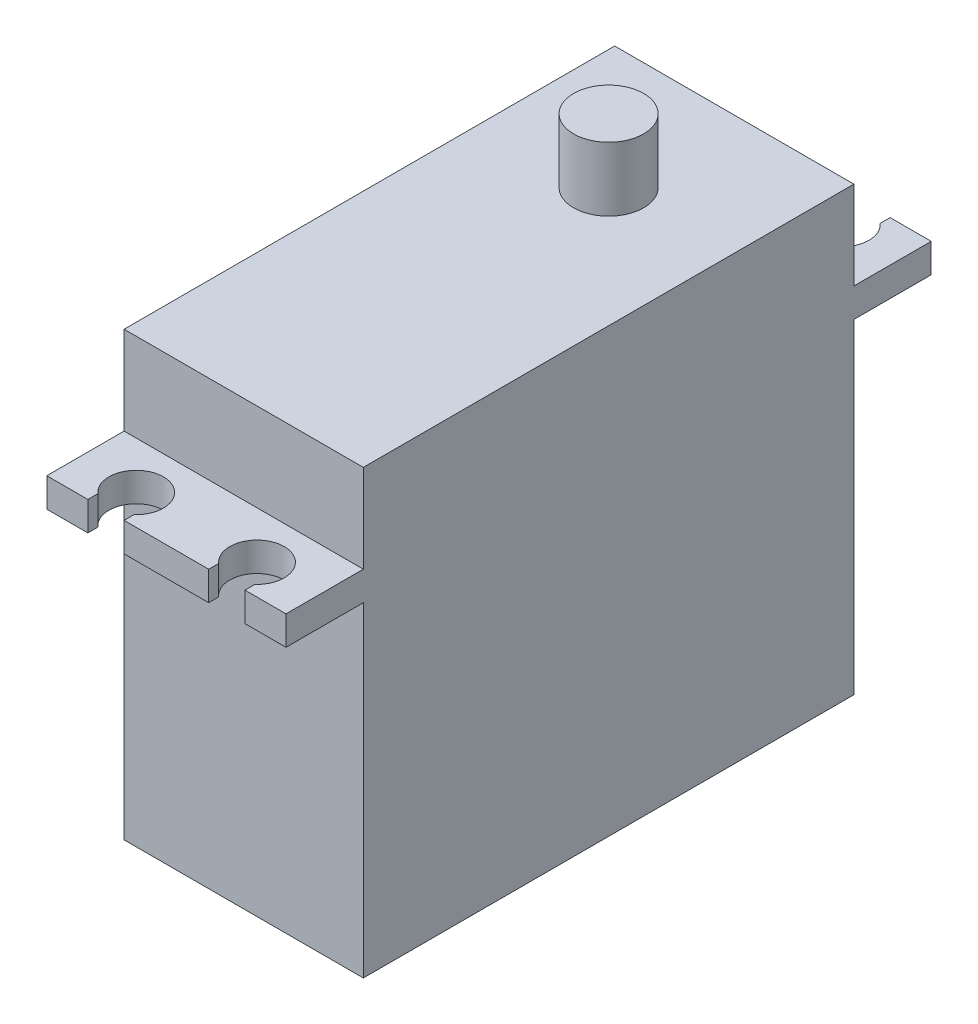
ISO-10303-21;
HEADER;
FILE_DESCRIPTION(('STEP AP214'),'2;1');
FILE_NAME('part.step','',(''),(''),'','','');
FILE_SCHEMA(('AUTOMOTIVE_DESIGN { 1 0 10303 214 1 1 1 1 }'));
ENDSEC;
DATA;
#1=APPLICATION_CONTEXT('core data for automotive mechanical design processes');
#2=APPLICATION_PROTOCOL_DEFINITION('international standard','automotive_design',2000,#1);
#3=PRODUCT_CONTEXT('',#1,'mechanical');
#4=PRODUCT('Part','Part','',(#3));
#5=PRODUCT_RELATED_PRODUCT_CATEGORY('part','',(#4));
#6=PRODUCT_DEFINITION_FORMATION('','',#4);
#7=PRODUCT_DEFINITION_CONTEXT('part definition',#1,'design');
#8=PRODUCT_DEFINITION('design','',#6,#7);
#9=PRODUCT_DEFINITION_SHAPE('','',#8);
#10=(LENGTH_UNIT() NAMED_UNIT(*) SI_UNIT(.MILLI.,.METRE.));
#11=(NAMED_UNIT(*) PLANE_ANGLE_UNIT() SI_UNIT($,.RADIAN.));
#12=(NAMED_UNIT(*) SI_UNIT($,.STERADIAN.) SOLID_ANGLE_UNIT());
#13=UNCERTAINTY_MEASURE_WITH_UNIT(LENGTH_MEASURE(1.E-05),#10,'distance_accuracy_value','');
#14=(GEOMETRIC_REPRESENTATION_CONTEXT(3) GLOBAL_UNCERTAINTY_ASSIGNED_CONTEXT((#13)) GLOBAL_UNIT_ASSIGNED_CONTEXT((#10,
#11,#12)) REPRESENTATION_CONTEXT('',''));
#15=CARTESIAN_POINT('',(0.,0.,0.));
#16=DIRECTION('',(0.,0.,1.));
#17=DIRECTION('',(1.,0.,0.));
#18=AXIS2_PLACEMENT_3D('',#15,#16,#17);
#19=CARTESIAN_POINT('',(19.8,0.,26.7));
#20=DIRECTION('',(0.,0.,-1.));
#21=DIRECTION('',(-1.,0.,0.));
#22=AXIS2_PLACEMENT_3D('',#19,#20,#21);
#23=PLANE('',#22);
#24=DIRECTION('',(0.,1.,0.));
#25=VECTOR('',#24,1.);
#26=CARTESIAN_POINT('',(13.4,-18.3000000000001,26.7));
#27=LINE('',#26,#25);
#28=CARTESIAN_POINT('',(13.4,8.59999999999999,26.7));
#29=VERTEX_POINT('',#28);
#30=CARTESIAN_POINT('',(13.4,10.9999999999999,26.7));
#31=VERTEX_POINT('',#30);
#32=EDGE_CURVE('E59',#29,#31,#27,.T.);
#33=ORIENTED_EDGE('',*,*,#32,.T.);
#34=DIRECTION('',(-1.,0.,0.));
#35=VECTOR('',#34,1.);
#36=CARTESIAN_POINT('',(19.8,11.,26.7));
#37=LINE('',#36,#35);
#38=CARTESIAN_POINT('',(6.4,10.9999999999999,26.7));
#39=VERTEX_POINT('',#38);
#40=EDGE_CURVE('E409',#31,#39,#37,.T.);
#41=ORIENTED_EDGE('',*,*,#40,.T.);
#42=DIRECTION('',(0.,1.,0.));
#43=VECTOR('',#42,1.);
#44=CARTESIAN_POINT('',(6.4,-18.3000000000001,26.7));
#45=LINE('',#44,#43);
#46=CARTESIAN_POINT('',(6.4,8.59999999999999,26.7));
#47=VERTEX_POINT('',#46);
#48=EDGE_CURVE('E247',#47,#39,#45,.T.);
#49=ORIENTED_EDGE('',*,*,#48,.F.);
#50=DIRECTION('',(-1.,0.,0.));
#51=VECTOR('',#50,1.);
#52=CARTESIAN_POINT('',(19.8,8.59999999999999,26.7));
#53=LINE('',#52,#51);
#54=EDGE_CURVE('E404',#29,#47,#53,.T.);
#55=ORIENTED_EDGE('',*,*,#54,.F.);
#56=EDGE_LOOP('',(#33,#41,#49,#55));
#57=FACE_BOUND('',#56,.T.);
#58=ADVANCED_FACE('F36',(#57),#23,.F.);
#59=DIRECTION('',(0.,1.,0.));
#60=VECTOR('',#59,1.);
#61=CARTESIAN_POINT('',(3.4,-18.3000000000001,26.7));
#62=LINE('',#61,#60);
#63=CARTESIAN_POINT('',(3.40000000000001,8.59999999999999,26.7));
#64=VERTEX_POINT('',#63);
#65=CARTESIAN_POINT('',(3.4,10.9999999999999,26.7));
#66=VERTEX_POINT('',#65);
#67=EDGE_CURVE('E51',#64,#66,#62,.T.);
#68=ORIENTED_EDGE('',*,*,#67,.T.);
#69=CARTESIAN_POINT('',(0.,11.,26.7));
#70=VERTEX_POINT('',#69);
#71=EDGE_CURVE('E241',#66,#70,#37,.T.);
#72=ORIENTED_EDGE('',*,*,#71,.T.);
#73=DIRECTION('',(0.,-1.,0.));
#74=VECTOR('',#73,1.);
#75=CARTESIAN_POINT('',(0.,0.,26.7));
#76=LINE('',#75,#74);
#77=CARTESIAN_POINT('',(0.,8.59999999999999,26.7));
#78=VERTEX_POINT('',#77);
#79=EDGE_CURVE('E363',#70,#78,#76,.T.);
#80=ORIENTED_EDGE('',*,*,#79,.T.);
#81=EDGE_CURVE('E400',#64,#78,#53,.T.);
#82=ORIENTED_EDGE('',*,*,#81,.F.);
#83=EDGE_LOOP('',(#68,#72,#80,#82));
#84=FACE_BOUND('',#83,.T.);
#85=ADVANCED_FACE('F454',(#84),#23,.F.);
#86=CARTESIAN_POINT('',(19.8,0.,-26.7));
#87=DIRECTION('',(0.,0.,-1.));
#88=DIRECTION('',(-1.,0.,0.));
#89=AXIS2_PLACEMENT_3D('',#86,#87,#88);
#90=PLANE('',#89);
#91=DIRECTION('',(-1.,0.,0.));
#92=VECTOR('',#91,1.);
#93=CARTESIAN_POINT('',(19.8,8.59999999999999,-26.7));
#94=LINE('',#93,#92);
#95=CARTESIAN_POINT('',(13.4,8.59999999999999,-26.7));
#96=VERTEX_POINT('',#95);
#97=CARTESIAN_POINT('',(6.4,8.59999999999999,-26.7));
#98=VERTEX_POINT('',#97);
#99=EDGE_CURVE('E391',#96,#98,#94,.T.);
#100=ORIENTED_EDGE('',*,*,#99,.T.);
#101=DIRECTION('',(0.,1.,0.));
#102=VECTOR('',#101,1.);
#103=CARTESIAN_POINT('',(6.4,-18.3,-26.7));
#104=LINE('',#103,#102);
#105=CARTESIAN_POINT('',(6.4,11.,-26.7));
#106=VERTEX_POINT('',#105);
#107=EDGE_CURVE('E265',#98,#106,#104,.T.);
#108=ORIENTED_EDGE('',*,*,#107,.T.);
#109=DIRECTION('',(-1.,0.,0.));
#110=VECTOR('',#109,1.);
#111=CARTESIAN_POINT('',(19.8,11.,-26.7));
#112=LINE('',#111,#110);
#113=CARTESIAN_POINT('',(13.4,11.,-26.7));
#114=VERTEX_POINT('',#113);
#115=EDGE_CURVE('E386',#114,#106,#112,.T.);
#116=ORIENTED_EDGE('',*,*,#115,.F.);
#117=DIRECTION('',(0.,1.,0.));
#118=VECTOR('',#117,1.);
#119=CARTESIAN_POINT('',(13.4,-18.3,-26.7));
#120=LINE('',#119,#118);
#121=EDGE_CURVE('E295',#96,#114,#120,.T.);
#122=ORIENTED_EDGE('',*,*,#121,.F.);
#123=EDGE_LOOP('',(#100,#108,#116,#122));
#124=FACE_BOUND('',#123,.T.);
#125=ADVANCED_FACE('F525',(#124),#90,.T.);
#126=CARTESIAN_POINT('',(19.8,8.59999999999999,-26.7));
#127=VERTEX_POINT('',#126);
#128=CARTESIAN_POINT('',(16.4,8.59999999999999,-26.7));
#129=VERTEX_POINT('',#128);
#130=EDGE_CURVE('E387',#127,#129,#94,.T.);
#131=ORIENTED_EDGE('',*,*,#130,.T.);
#132=DIRECTION('',(0.,1.,0.));
#133=VECTOR('',#132,1.);
#134=CARTESIAN_POINT('',(16.4,-18.3,-26.7));
#135=LINE('',#134,#133);
#136=CARTESIAN_POINT('',(16.4,11.,-26.7));
#137=VERTEX_POINT('',#136);
#138=EDGE_CURVE('E297',#129,#137,#135,.T.);
#139=ORIENTED_EDGE('',*,*,#138,.T.);
#140=CARTESIAN_POINT('',(19.8,11.,-26.7));
#141=VERTEX_POINT('',#140);
#142=EDGE_CURVE('E382',#141,#137,#112,.T.);
#143=ORIENTED_EDGE('',*,*,#142,.F.);
#144=DIRECTION('',(0.,-1.,0.));
#145=VECTOR('',#144,1.);
#146=CARTESIAN_POINT('',(19.8,0.,-26.7));
#147=LINE('',#146,#145);
#148=EDGE_CURVE('E346',#141,#127,#147,.T.);
#149=ORIENTED_EDGE('',*,*,#148,.T.);
#150=EDGE_LOOP('',(#131,#139,#143,#149));
#151=FACE_BOUND('',#150,.T.);
#152=ADVANCED_FACE('F509',(#151),#90,.T.);
#153=CARTESIAN_POINT('',(19.8,0.,0.));
#154=DIRECTION('',(1.,0.,0.));
#155=DIRECTION('',(0.,0.,-1.));
#156=AXIS2_PLACEMENT_3D('',#153,#154,#155);
#157=PLANE('',#156);
#158=DIRECTION('',(0.,0.,-1.));
#159=VECTOR('',#158,1.);
#160=CARTESIAN_POINT('',(19.8,18.3,0.));
#161=LINE('',#160,#159);
#162=CARTESIAN_POINT('',(19.8,18.3,20.3));
#163=VERTEX_POINT('',#162);
#164=CARTESIAN_POINT('',(19.8,18.3,-20.3));
#165=VERTEX_POINT('',#164);
#166=EDGE_CURVE('E327',#163,#165,#161,.T.);
#167=ORIENTED_EDGE('',*,*,#166,.F.);
#168=DIRECTION('',(0.,-1.,0.));
#169=VECTOR('',#168,1.);
#170=CARTESIAN_POINT('',(19.8,0.,20.3));
#171=LINE('',#170,#169);
#172=CARTESIAN_POINT('',(19.8,11.,20.3));
#173=VERTEX_POINT('',#172);
#174=EDGE_CURVE('E332',#163,#173,#171,.T.);
#175=ORIENTED_EDGE('',*,*,#174,.T.);
#176=DIRECTION('',(0.,0.,1.));
#177=VECTOR('',#176,1.);
#178=CARTESIAN_POINT('',(19.8,11.,0.));
#179=LINE('',#178,#177);
#180=CARTESIAN_POINT('',(19.8,11.,26.7));
#181=VERTEX_POINT('',#180);
#182=EDGE_CURVE('E334',#173,#181,#179,.T.);
#183=ORIENTED_EDGE('',*,*,#182,.T.);
#184=DIRECTION('',(0.,-1.,0.));
#185=VECTOR('',#184,1.);
#186=CARTESIAN_POINT('',(19.8,0.,26.7));
#187=LINE('',#186,#185);
#188=CARTESIAN_POINT('',(19.8,8.59999999999999,26.7));
#189=VERTEX_POINT('',#188);
#190=EDGE_CURVE('E337',#181,#189,#187,.T.);
#191=ORIENTED_EDGE('',*,*,#190,.T.);
#192=DIRECTION('',(0.,0.,1.));
#193=VECTOR('',#192,1.);
#194=CARTESIAN_POINT('',(19.8,8.59999999999999,0.));
#195=LINE('',#194,#193);
#196=CARTESIAN_POINT('',(19.8,8.59999999999999,20.3));
#197=VERTEX_POINT('',#196);
#198=EDGE_CURVE('E339',#197,#189,#195,.T.);
#199=ORIENTED_EDGE('',*,*,#198,.F.);
#200=CARTESIAN_POINT('',(19.8,-18.3,20.3));
#201=VERTEX_POINT('',#200);
#202=EDGE_CURVE('E335',#197,#201,#171,.T.);
#203=ORIENTED_EDGE('',*,*,#202,.T.);
#204=DIRECTION('',(0.,0.,-1.));
#205=VECTOR('',#204,1.);
#206=CARTESIAN_POINT('',(19.8,-18.3,0.));
#207=LINE('',#206,#205);
#208=CARTESIAN_POINT('',(19.8,-18.3,-20.3));
#209=VERTEX_POINT('',#208);
#210=EDGE_CURVE('E342',#201,#209,#207,.T.);
#211=ORIENTED_EDGE('',*,*,#210,.T.);
#212=DIRECTION('',(0.,-1.,0.));
#213=VECTOR('',#212,1.);
#214=CARTESIAN_POINT('',(19.8,0.,-20.3));
#215=LINE('',#214,#213);
#216=CARTESIAN_POINT('',(19.8,8.6,-20.3));
#217=VERTEX_POINT('',#216);
#218=EDGE_CURVE('E329',#217,#209,#215,.T.);
#219=ORIENTED_EDGE('',*,*,#218,.F.);
#220=DIRECTION('',(0.,0.,-1.));
#221=VECTOR('',#220,1.);
#222=CARTESIAN_POINT('',(19.8,8.60000000000001,0.));
#223=LINE('',#222,#221);
#224=EDGE_CURVE('E344',#217,#127,#223,.T.);
#225=ORIENTED_EDGE('',*,*,#224,.T.);
#226=ORIENTED_EDGE('',*,*,#148,.F.);
#227=DIRECTION('',(0.,0.,-1.));
#228=VECTOR('',#227,1.);
#229=CARTESIAN_POINT('',(19.8,11.,0.));
#230=LINE('',#229,#228);
#231=CARTESIAN_POINT('',(19.8,11.,-20.3));
#232=VERTEX_POINT('',#231);
#233=EDGE_CURVE('E349',#232,#141,#230,.T.);
#234=ORIENTED_EDGE('',*,*,#233,.F.);
#235=EDGE_CURVE('E324',#165,#232,#215,.T.);
#236=ORIENTED_EDGE('',*,*,#235,.F.);
#237=EDGE_LOOP('',(#167,#175,#183,#191,#199,#203,#211,#219,#225,#226,#234,#236));
#238=FACE_BOUND('',#237,.T.);
#239=ADVANCED_FACE('F472',(#238),#157,.T.);
#240=CARTESIAN_POINT('',(19.8,23.6,0.));
#241=DIRECTION('',(0.,1.,0.));
#242=DIRECTION('',(0.,0.,1.));
#243=AXIS2_PLACEMENT_3D('',#240,#241,#242);
#244=PLANE('',#243);
#245=CARTESIAN_POINT('',(9.9,23.6,-9.9));
#246=DIRECTION('',(0.,1.,0.));
#247=DIRECTION('',(0.,0.,1.));
#248=AXIS2_PLACEMENT_3D('',#245,#246,#247);
#249=CIRCLE('',#248,2.9);
#250=CARTESIAN_POINT('',(9.9,23.6,-7.));
#251=VERTEX_POINT('',#250);
#252=EDGE_CURVE('E320',#251,#251,#249,.T.);
#253=ORIENTED_EDGE('',*,*,#252,.T.);
#254=EDGE_LOOP('',(#253));
#255=FACE_BOUND('',#254,.T.);
#256=ADVANCED_FACE('F38',(#255),#244,.T.);
#257=CARTESIAN_POINT('',(0.,0.,0.));
#258=DIRECTION('',(1.,0.,0.));
#259=DIRECTION('',(0.,0.,-1.));
#260=AXIS2_PLACEMENT_3D('',#257,#258,#259);
#261=PLANE('',#260);
#262=DIRECTION('',(0.,0.,-1.));
#263=VECTOR('',#262,1.);
#264=CARTESIAN_POINT('',(0.,18.3,0.));
#265=LINE('',#264,#263);
#266=CARTESIAN_POINT('',(0.,18.3,20.3));
#267=VERTEX_POINT('',#266);
#268=CARTESIAN_POINT('',(0.,18.3,-20.3));
#269=VERTEX_POINT('',#268);
#270=EDGE_CURVE('E355',#267,#269,#265,.T.);
#271=ORIENTED_EDGE('',*,*,#270,.T.);
#272=DIRECTION('',(0.,-1.,0.));
#273=VECTOR('',#272,1.);
#274=CARTESIAN_POINT('',(0.,0.,-20.3));
#275=LINE('',#274,#273);
#276=CARTESIAN_POINT('',(0.,11.,-20.3));
#277=VERTEX_POINT('',#276);
#278=EDGE_CURVE('E323',#269,#277,#275,.T.);
#279=ORIENTED_EDGE('',*,*,#278,.T.);
#280=DIRECTION('',(0.,0.,-1.));
#281=VECTOR('',#280,1.);
#282=CARTESIAN_POINT('',(0.,11.,0.));
#283=LINE('',#282,#281);
#284=CARTESIAN_POINT('',(0.,11.,-26.7));
#285=VERTEX_POINT('',#284);
#286=EDGE_CURVE('E328',#277,#285,#283,.T.);
#287=ORIENTED_EDGE('',*,*,#286,.T.);
#288=DIRECTION('',(0.,-1.,0.));
#289=VECTOR('',#288,1.);
#290=CARTESIAN_POINT('',(0.,0.,-26.7));
#291=LINE('',#290,#289);
#292=CARTESIAN_POINT('',(0.,8.59999999999999,-26.7));
#293=VERTEX_POINT('',#292);
#294=EDGE_CURVE('E375',#285,#293,#291,.T.);
#295=ORIENTED_EDGE('',*,*,#294,.T.);
#296=DIRECTION('',(0.,0.,-1.));
#297=VECTOR('',#296,1.);
#298=CARTESIAN_POINT('',(0.,8.60000000000001,0.));
#299=LINE('',#298,#297);
#300=CARTESIAN_POINT('',(0.,8.6,-20.3));
#301=VERTEX_POINT('',#300);
#302=EDGE_CURVE('E372',#301,#293,#299,.T.);
#303=ORIENTED_EDGE('',*,*,#302,.F.);
#304=CARTESIAN_POINT('',(0.,-18.3,-20.3));
#305=VERTEX_POINT('',#304);
#306=EDGE_CURVE('E356',#301,#305,#275,.T.);
#307=ORIENTED_EDGE('',*,*,#306,.T.);
#308=DIRECTION('',(0.,0.,-1.));
#309=VECTOR('',#308,1.);
#310=CARTESIAN_POINT('',(0.,-18.3,0.));
#311=LINE('',#310,#309);
#312=CARTESIAN_POINT('',(0.,-18.3,20.3));
#313=VERTEX_POINT('',#312);
#314=EDGE_CURVE('E369',#313,#305,#311,.T.);
#315=ORIENTED_EDGE('',*,*,#314,.F.);
#316=DIRECTION('',(0.,-1.,0.));
#317=VECTOR('',#316,1.);
#318=CARTESIAN_POINT('',(0.,0.,20.3));
#319=LINE('',#318,#317);
#320=CARTESIAN_POINT('',(0.,8.59999999999999,20.3));
#321=VERTEX_POINT('',#320);
#322=EDGE_CURVE('E361',#321,#313,#319,.T.);
#323=ORIENTED_EDGE('',*,*,#322,.F.);
#324=DIRECTION('',(0.,0.,1.));
#325=VECTOR('',#324,1.);
#326=CARTESIAN_POINT('',(0.,8.59999999999999,0.));
#327=LINE('',#326,#325);
#328=EDGE_CURVE('E366',#321,#78,#327,.T.);
#329=ORIENTED_EDGE('',*,*,#328,.T.);
#330=ORIENTED_EDGE('',*,*,#79,.F.);
#331=DIRECTION('',(0.,0.,1.));
#332=VECTOR('',#331,1.);
#333=CARTESIAN_POINT('',(0.,11.,0.));
#334=LINE('',#333,#332);
#335=CARTESIAN_POINT('',(0.,11.,20.3));
#336=VERTEX_POINT('',#335);
#337=EDGE_CURVE('E360',#336,#70,#334,.T.);
#338=ORIENTED_EDGE('',*,*,#337,.F.);
#339=EDGE_CURVE('E358',#267,#336,#319,.T.);
#340=ORIENTED_EDGE('',*,*,#339,.F.);
#341=EDGE_LOOP('',(#271,#279,#287,#295,#303,#307,#315,#323,#329,#330,#338,#340));
#342=FACE_BOUND('',#341,.T.);
#343=ADVANCED_FACE('F458',(#342),#261,.F.);
#344=CARTESIAN_POINT('',(19.8,0.,-20.3));
#345=DIRECTION('',(0.,0.,-1.));
#346=DIRECTION('',(0.,1.,0.));
#347=AXIS2_PLACEMENT_3D('',#344,#345,#346);
#348=PLANE('',#347);
#349=ORIENTED_EDGE('',*,*,#278,.F.);
#350=DIRECTION('',(-1.,0.,0.));
#351=VECTOR('',#350,1.);
#352=CARTESIAN_POINT('',(19.8,18.3,-20.3));
#353=LINE('',#352,#351);
#354=EDGE_CURVE('E414',#165,#269,#353,.T.);
#355=ORIENTED_EDGE('',*,*,#354,.F.);
#356=ORIENTED_EDGE('',*,*,#235,.T.);
#357=DIRECTION('',(-1.,0.,0.));
#358=VECTOR('',#357,1.);
#359=CARTESIAN_POINT('',(19.8,11.,-20.3));
#360=LINE('',#359,#358);
#361=EDGE_CURVE('E352',#232,#277,#360,.T.);
#362=ORIENTED_EDGE('',*,*,#361,.T.);
#363=EDGE_LOOP('',(#349,#355,#356,#362));
#364=FACE_BOUND('',#363,.T.);
#365=ADVANCED_FACE('F484',(#364),#348,.T.);
#366=CARTESIAN_POINT('',(19.8,18.3,0.));
#367=DIRECTION('',(0.,1.,0.));
#368=DIRECTION('',(0.,0.,1.));
#369=AXIS2_PLACEMENT_3D('',#366,#367,#368);
#370=PLANE('',#369);
#371=CARTESIAN_POINT('',(9.9,18.3,-9.9));
#372=DIRECTION('',(0.,1.,0.));
#373=DIRECTION('',(0.,0.,1.));
#374=AXIS2_PLACEMENT_3D('',#371,#372,#373);
#375=CIRCLE('',#374,2.9);
#376=CARTESIAN_POINT('',(9.9,18.3,-7.));
#377=VERTEX_POINT('',#376);
#378=EDGE_CURVE('E317',#377,#377,#375,.T.);
#379=ORIENTED_EDGE('',*,*,#378,.F.);
#380=EDGE_LOOP('',(#379));
#381=FACE_BOUND('',#380,.T.);
#382=ORIENTED_EDGE('',*,*,#270,.F.);
#383=DIRECTION('',(-1.,0.,0.));
#384=VECTOR('',#383,1.);
#385=CARTESIAN_POINT('',(19.8,18.3,20.3));
#386=LINE('',#385,#384);
#387=EDGE_CURVE('E412',#163,#267,#386,.T.);
#388=ORIENTED_EDGE('',*,*,#387,.F.);
#389=ORIENTED_EDGE('',*,*,#166,.T.);
#390=ORIENTED_EDGE('',*,*,#354,.T.);
#391=EDGE_LOOP('',(#382,#388,#389,#390));
#392=FACE_BOUND('',#391,.T.);
#393=ADVANCED_FACE('F480',(#381,#392),#370,.T.);
#394=CARTESIAN_POINT('',(19.8,0.,20.3));
#395=DIRECTION('',(0.,0.,-1.));
#396=DIRECTION('',(0.,1.,0.));
#397=AXIS2_PLACEMENT_3D('',#394,#395,#396);
#398=PLANE('',#397);
#399=ORIENTED_EDGE('',*,*,#339,.T.);
#400=DIRECTION('',(-1.,0.,0.));
#401=VECTOR('',#400,1.);
#402=CARTESIAN_POINT('',(19.8,11.,20.3));
#403=LINE('',#402,#401);
#404=EDGE_CURVE('E408',#173,#336,#403,.T.);
#405=ORIENTED_EDGE('',*,*,#404,.F.);
#406=ORIENTED_EDGE('',*,*,#174,.F.);
#407=ORIENTED_EDGE('',*,*,#387,.T.);
#408=EDGE_LOOP('',(#399,#405,#406,#407));
#409=FACE_BOUND('',#408,.T.);
#410=ADVANCED_FACE('F556',(#409),#398,.F.);
#411=CARTESIAN_POINT('',(19.8,11.,0.));
#412=DIRECTION('',(0.,-1.,0.));
#413=DIRECTION('',(0.,0.,-1.));
#414=AXIS2_PLACEMENT_3D('',#411,#412,#413);
#415=PLANE('',#414);
#416=CARTESIAN_POINT('',(14.9,11.,24.2));
#417=DIRECTION('',(0.,1.,0.));
#418=DIRECTION('',(0.,0.,1.));
#419=AXIS2_PLACEMENT_3D('',#416,#417,#418);
#420=CIRCLE('',#419,2.25);
#421=CARTESIAN_POINT('',(16.4,10.9999999999999,25.8770509831248));
#422=VERTEX_POINT('',#421);
#423=CARTESIAN_POINT('',(13.4,10.9999999999999,25.8770509831249));
#424=VERTEX_POINT('',#423);
#425=EDGE_CURVE('E246',#422,#424,#420,.T.);
#426=ORIENTED_EDGE('',*,*,#425,.F.);
#427=DIRECTION('',(0.,0.,-1.));
#428=VECTOR('',#427,1.);
#429=CARTESIAN_POINT('',(16.4,11.,0.));
#430=LINE('',#429,#428);
#431=CARTESIAN_POINT('',(16.4,10.9999999999999,26.7));
#432=VERTEX_POINT('',#431);
#433=EDGE_CURVE('E275',#432,#422,#430,.T.);
#434=ORIENTED_EDGE('',*,*,#433,.F.);
#435=EDGE_CURVE('E405',#181,#432,#37,.T.);
#436=ORIENTED_EDGE('',*,*,#435,.F.);
#437=ORIENTED_EDGE('',*,*,#182,.F.);
#438=ORIENTED_EDGE('',*,*,#404,.T.);
#439=ORIENTED_EDGE('',*,*,#337,.T.);
#440=ORIENTED_EDGE('',*,*,#71,.F.);
#441=DIRECTION('',(0.,0.,-1.));
#442=VECTOR('',#441,1.);
#443=CARTESIAN_POINT('',(3.39999999999999,11.,0.));
#444=LINE('',#443,#442);
#445=CARTESIAN_POINT('',(3.4,10.9999999999999,25.8770509831248));
#446=VERTEX_POINT('',#445);
#447=EDGE_CURVE('E222',#66,#446,#444,.T.);
#448=ORIENTED_EDGE('',*,*,#447,.T.);
#449=CARTESIAN_POINT('',(4.9,11.,24.2));
#450=DIRECTION('',(0.,1.,0.));
#451=DIRECTION('',(0.,0.,1.));
#452=AXIS2_PLACEMENT_3D('',#449,#450,#451);
#453=CIRCLE('',#452,2.25);
#454=CARTESIAN_POINT('',(6.4,10.9999999999999,25.8770509831248));
#455=VERTEX_POINT('',#454);
#456=EDGE_CURVE('E229',#455,#446,#453,.T.);
#457=ORIENTED_EDGE('',*,*,#456,.F.);
#458=DIRECTION('',(0.,0.,-1.));
#459=VECTOR('',#458,1.);
#460=CARTESIAN_POINT('',(6.4,11.,0.));
#461=LINE('',#460,#459);
#462=EDGE_CURVE('E226',#39,#455,#461,.T.);
#463=ORIENTED_EDGE('',*,*,#462,.F.);
#464=ORIENTED_EDGE('',*,*,#40,.F.);
#465=DIRECTION('',(0.,0.,-1.));
#466=VECTOR('',#465,1.);
#467=CARTESIAN_POINT('',(13.4,11.,0.));
#468=LINE('',#467,#466);
#469=EDGE_CURVE('E272',#31,#424,#468,.T.);
#470=ORIENTED_EDGE('',*,*,#469,.T.);
#471=EDGE_LOOP('',(#426,#434,#436,#437,#438,#439,#440,#448,#457,#463,#464,#470));
#472=FACE_BOUND('',#471,.T.);
#473=ADVANCED_FACE('F239',(#472),#415,.F.);
#474=ORIENTED_EDGE('',*,*,#435,.T.);
#475=DIRECTION('',(0.,1.,0.));
#476=VECTOR('',#475,1.);
#477=CARTESIAN_POINT('',(16.4,-18.3000000000001,26.7));
#478=LINE('',#477,#476);
#479=CARTESIAN_POINT('',(16.4,8.59999999999999,26.7));
#480=VERTEX_POINT('',#479);
#481=EDGE_CURVE('E280',#480,#432,#478,.T.);
#482=ORIENTED_EDGE('',*,*,#481,.F.);
#483=EDGE_CURVE('E401',#189,#480,#53,.T.);
#484=ORIENTED_EDGE('',*,*,#483,.F.);
#485=ORIENTED_EDGE('',*,*,#190,.F.);
#486=EDGE_LOOP('',(#474,#482,#484,#485));
#487=FACE_BOUND('',#486,.T.);
#488=ADVANCED_FACE('F439',(#487),#23,.F.);
#489=CARTESIAN_POINT('',(19.8,8.59999999999999,0.));
#490=DIRECTION('',(0.,-1.,0.));
#491=DIRECTION('',(0.,0.,-1.));
#492=AXIS2_PLACEMENT_3D('',#489,#490,#491);
#493=PLANE('',#492);
#494=DIRECTION('',(0.,0.,1.));
#495=VECTOR('',#494,1.);
#496=CARTESIAN_POINT('',(16.4,8.59999999999999,0.));
#497=LINE('',#496,#495);
#498=CARTESIAN_POINT('',(16.4,8.59999999999999,25.8770509831248));
#499=VERTEX_POINT('',#498);
#500=EDGE_CURVE('E11',#499,#480,#497,.T.);
#501=ORIENTED_EDGE('',*,*,#500,.F.);
#502=CARTESIAN_POINT('',(14.9,8.59999999999999,24.2));
#503=DIRECTION('',(0.,-1.,0.));
#504=DIRECTION('',(0.,0.,-1.));
#505=AXIS2_PLACEMENT_3D('',#502,#503,#504);
#506=CIRCLE('',#505,2.25);
#507=CARTESIAN_POINT('',(13.4,8.59999999999999,25.8770509831248));
#508=VERTEX_POINT('',#507);
#509=EDGE_CURVE('E44',#508,#499,#506,.T.);
#510=ORIENTED_EDGE('',*,*,#509,.F.);
#511=DIRECTION('',(0.,0.,1.));
#512=VECTOR('',#511,1.);
#513=CARTESIAN_POINT('',(13.4,8.59999999999999,0.));
#514=LINE('',#513,#512);
#515=EDGE_CURVE('E422',#508,#29,#514,.T.);
#516=ORIENTED_EDGE('',*,*,#515,.T.);
#517=ORIENTED_EDGE('',*,*,#54,.T.);
#518=DIRECTION('',(0.,0.,1.));
#519=VECTOR('',#518,1.);
#520=CARTESIAN_POINT('',(6.4,8.59999999999999,0.));
#521=LINE('',#520,#519);
#522=CARTESIAN_POINT('',(6.4,8.59999999999999,25.8770509831248));
#523=VERTEX_POINT('',#522);
#524=EDGE_CURVE('E420',#523,#47,#521,.T.);
#525=ORIENTED_EDGE('',*,*,#524,.F.);
#526=CARTESIAN_POINT('',(4.9,8.59999999999999,24.2));
#527=DIRECTION('',(0.,-1.,0.));
#528=DIRECTION('',(0.,0.,-1.));
#529=AXIS2_PLACEMENT_3D('',#526,#527,#528);
#530=CIRCLE('',#529,2.25);
#531=CARTESIAN_POINT('',(3.4,8.59999999999999,25.8770509831248));
#532=VERTEX_POINT('',#531);
#533=EDGE_CURVE('E418',#532,#523,#530,.T.);
#534=ORIENTED_EDGE('',*,*,#533,.F.);
#535=DIRECTION('',(0.,0.,1.));
#536=VECTOR('',#535,1.);
#537=CARTESIAN_POINT('',(3.39999999999999,8.59999999999999,0.));
#538=LINE('',#537,#536);
#539=EDGE_CURVE('E223',#532,#64,#538,.T.);
#540=ORIENTED_EDGE('',*,*,#539,.T.);
#541=ORIENTED_EDGE('',*,*,#81,.T.);
#542=ORIENTED_EDGE('',*,*,#328,.F.);
#543=DIRECTION('',(-1.,0.,0.));
#544=VECTOR('',#543,1.);
#545=CARTESIAN_POINT('',(19.8,8.59999999999999,20.3));
#546=LINE('',#545,#544);
#547=EDGE_CURVE('E398',#197,#321,#546,.T.);
#548=ORIENTED_EDGE('',*,*,#547,.F.);
#549=ORIENTED_EDGE('',*,*,#198,.T.);
#550=ORIENTED_EDGE('',*,*,#483,.T.);
#551=EDGE_LOOP('',(#501,#510,#516,#517,#525,#534,#540,#541,#542,#548,#549,#550));
#552=FACE_BOUND('',#551,.T.);
#553=ADVANCED_FACE('F434',(#552),#493,.T.);
#554=ORIENTED_EDGE('',*,*,#322,.T.);
#555=DIRECTION('',(-1.,0.,0.));
#556=VECTOR('',#555,1.);
#557=CARTESIAN_POINT('',(19.8,-18.3,20.3));
#558=LINE('',#557,#556);
#559=EDGE_CURVE('E395',#201,#313,#558,.T.);
#560=ORIENTED_EDGE('',*,*,#559,.F.);
#561=ORIENTED_EDGE('',*,*,#202,.F.);
#562=ORIENTED_EDGE('',*,*,#547,.T.);
#563=EDGE_LOOP('',(#554,#560,#561,#562));
#564=FACE_BOUND('',#563,.T.);
#565=ADVANCED_FACE('F463',(#564),#398,.F.);
#566=CARTESIAN_POINT('',(19.8,-18.3,0.));
#567=DIRECTION('',(0.,1.,0.));
#568=DIRECTION('',(0.,0.,1.));
#569=AXIS2_PLACEMENT_3D('',#566,#567,#568);
#570=PLANE('',#569);
#571=ORIENTED_EDGE('',*,*,#314,.T.);
#572=DIRECTION('',(-1.,0.,0.));
#573=VECTOR('',#572,1.);
#574=CARTESIAN_POINT('',(19.8,-18.3,-20.3));
#575=LINE('',#574,#573);
#576=EDGE_CURVE('E393',#209,#305,#575,.T.);
#577=ORIENTED_EDGE('',*,*,#576,.F.);
#578=ORIENTED_EDGE('',*,*,#210,.F.);
#579=ORIENTED_EDGE('',*,*,#559,.T.);
#580=EDGE_LOOP('',(#571,#577,#578,#579));
#581=FACE_BOUND('',#580,.T.);
#582=ADVANCED_FACE('F467',(#581),#570,.F.);
#583=ORIENTED_EDGE('',*,*,#306,.F.);
#584=DIRECTION('',(-1.,0.,0.));
#585=VECTOR('',#584,1.);
#586=CARTESIAN_POINT('',(19.8,8.6,-20.3));
#587=LINE('',#586,#585);
#588=EDGE_CURVE('E390',#217,#301,#587,.T.);
#589=ORIENTED_EDGE('',*,*,#588,.F.);
#590=ORIENTED_EDGE('',*,*,#218,.T.);
#591=ORIENTED_EDGE('',*,*,#576,.T.);
#592=EDGE_LOOP('',(#583,#589,#590,#591));
#593=FACE_BOUND('',#592,.T.);
#594=ADVANCED_FACE('F500',(#593),#348,.T.);
#595=CARTESIAN_POINT('',(19.8,8.60000000000001,0.));
#596=DIRECTION('',(0.,1.,0.));
#597=DIRECTION('',(0.,0.,1.));
#598=AXIS2_PLACEMENT_3D('',#595,#596,#597);
#599=PLANE('',#598);
#600=CARTESIAN_POINT('',(3.4,8.59999999999999,-26.7));
#601=VERTEX_POINT('',#600);
#602=EDGE_CURVE('E385',#601,#293,#94,.T.);
#603=ORIENTED_EDGE('',*,*,#602,.F.);
#604=DIRECTION('',(0.,0.,1.));
#605=VECTOR('',#604,1.);
#606=CARTESIAN_POINT('',(3.4,8.60000000000001,0.));
#607=LINE('',#606,#605);
#608=CARTESIAN_POINT('',(3.4,8.59999999999999,-25.8770509831248));
#609=VERTEX_POINT('',#608);
#610=EDGE_CURVE('E311',#601,#609,#607,.T.);
#611=ORIENTED_EDGE('',*,*,#610,.T.);
#612=CARTESIAN_POINT('',(4.9,8.59999999999999,-24.2));
#613=DIRECTION('',(0.,1.,0.));
#614=DIRECTION('',(0.,0.,1.));
#615=AXIS2_PLACEMENT_3D('',#612,#613,#614);
#616=CIRCLE('',#615,2.25);
#617=CARTESIAN_POINT('',(6.4,8.59999999999999,-25.8770509831248));
#618=VERTEX_POINT('',#617);
#619=EDGE_CURVE('E314',#609,#618,#616,.T.);
#620=ORIENTED_EDGE('',*,*,#619,.T.);
#621=DIRECTION('',(0.,0.,1.));
#622=VECTOR('',#621,1.);
#623=CARTESIAN_POINT('',(6.4,8.60000000000001,0.));
#624=LINE('',#623,#622);
#625=EDGE_CURVE('E309',#98,#618,#624,.T.);
#626=ORIENTED_EDGE('',*,*,#625,.F.);
#627=ORIENTED_EDGE('',*,*,#99,.F.);
#628=DIRECTION('',(0.,0.,1.));
#629=VECTOR('',#628,1.);
#630=CARTESIAN_POINT('',(13.4,8.60000000000001,0.));
#631=LINE('',#630,#629);
#632=CARTESIAN_POINT('',(13.4,8.59999999999999,-25.8770509831248));
#633=VERTEX_POINT('',#632);
#634=EDGE_CURVE('E303',#96,#633,#631,.T.);
#635=ORIENTED_EDGE('',*,*,#634,.T.);
#636=CARTESIAN_POINT('',(14.9,8.59999999999999,-24.2));
#637=DIRECTION('',(0.,1.,0.));
#638=DIRECTION('',(0.,0.,1.));
#639=AXIS2_PLACEMENT_3D('',#636,#637,#638);
#640=CIRCLE('',#639,2.25);
#641=CARTESIAN_POINT('',(16.4,8.59999999999999,-25.8770509831248));
#642=VERTEX_POINT('',#641);
#643=EDGE_CURVE('E306',#633,#642,#640,.T.);
#644=ORIENTED_EDGE('',*,*,#643,.T.);
#645=DIRECTION('',(0.,0.,1.));
#646=VECTOR('',#645,1.);
#647=CARTESIAN_POINT('',(16.4,8.60000000000001,0.));
#648=LINE('',#647,#646);
#649=EDGE_CURVE('E294',#129,#642,#648,.T.);
#650=ORIENTED_EDGE('',*,*,#649,.F.);
#651=ORIENTED_EDGE('',*,*,#130,.F.);
#652=ORIENTED_EDGE('',*,*,#224,.F.);
#653=ORIENTED_EDGE('',*,*,#588,.T.);
#654=ORIENTED_EDGE('',*,*,#302,.T.);
#655=EDGE_LOOP('',(#603,#611,#620,#626,#627,#635,#644,#650,#651,#652,#653,#654));
#656=FACE_BOUND('',#655,.T.);
#657=ADVANCED_FACE('F503',(#656),#599,.F.);
#658=DIRECTION('',(0.,1.,0.));
#659=VECTOR('',#658,1.);
#660=CARTESIAN_POINT('',(3.4,-18.3,-26.7));
#661=LINE('',#660,#659);
#662=CARTESIAN_POINT('',(3.4,11.,-26.7));
#663=VERTEX_POINT('',#662);
#664=EDGE_CURVE('E263',#601,#663,#661,.T.);
#665=ORIENTED_EDGE('',*,*,#664,.F.);
#666=ORIENTED_EDGE('',*,*,#602,.T.);
#667=ORIENTED_EDGE('',*,*,#294,.F.);
#668=EDGE_CURVE('E381',#663,#285,#112,.T.);
#669=ORIENTED_EDGE('',*,*,#668,.F.);
#670=EDGE_LOOP('',(#665,#666,#667,#669));
#671=FACE_BOUND('',#670,.T.);
#672=ADVANCED_FACE('F494',(#671),#90,.T.);
#673=CARTESIAN_POINT('',(19.8,11.,0.));
#674=DIRECTION('',(0.,1.,0.));
#675=DIRECTION('',(0.,0.,1.));
#676=AXIS2_PLACEMENT_3D('',#673,#674,#675);
#677=PLANE('',#676);
#678=DIRECTION('',(0.,0.,1.));
#679=VECTOR('',#678,1.);
#680=CARTESIAN_POINT('',(3.4,11.,0.));
#681=LINE('',#680,#679);
#682=CARTESIAN_POINT('',(3.4,11.,-25.8770509831248));
#683=VERTEX_POINT('',#682);
#684=EDGE_CURVE('E256',#663,#683,#681,.T.);
#685=ORIENTED_EDGE('',*,*,#684,.F.);
#686=ORIENTED_EDGE('',*,*,#668,.T.);
#687=ORIENTED_EDGE('',*,*,#286,.F.);
#688=ORIENTED_EDGE('',*,*,#361,.F.);
#689=ORIENTED_EDGE('',*,*,#233,.T.);
#690=ORIENTED_EDGE('',*,*,#142,.T.);
#691=DIRECTION('',(0.,0.,1.));
#692=VECTOR('',#691,1.);
#693=CARTESIAN_POINT('',(16.4,11.,0.));
#694=LINE('',#693,#692);
#695=CARTESIAN_POINT('',(16.4,11.,-25.8770509831248));
#696=VERTEX_POINT('',#695);
#697=EDGE_CURVE('E285',#137,#696,#694,.T.);
#698=ORIENTED_EDGE('',*,*,#697,.T.);
#699=CARTESIAN_POINT('',(14.9,11.,-24.2));
#700=DIRECTION('',(0.,1.,0.));
#701=DIRECTION('',(0.,0.,1.));
#702=AXIS2_PLACEMENT_3D('',#699,#700,#701);
#703=CIRCLE('',#702,2.25);
#704=CARTESIAN_POINT('',(13.4,11.,-25.8770509831248));
#705=VERTEX_POINT('',#704);
#706=EDGE_CURVE('E262',#705,#696,#703,.T.);
#707=ORIENTED_EDGE('',*,*,#706,.F.);
#708=DIRECTION('',(0.,0.,1.));
#709=VECTOR('',#708,1.);
#710=CARTESIAN_POINT('',(13.4,11.,0.));
#711=LINE('',#710,#709);
#712=EDGE_CURVE('E288',#114,#705,#711,.T.);
#713=ORIENTED_EDGE('',*,*,#712,.F.);
#714=ORIENTED_EDGE('',*,*,#115,.T.);
#715=DIRECTION('',(0.,0.,1.));
#716=VECTOR('',#715,1.);
#717=CARTESIAN_POINT('',(6.4,11.,0.));
#718=LINE('',#717,#716);
#719=CARTESIAN_POINT('',(6.4,11.,-25.8770509831248));
#720=VERTEX_POINT('',#719);
#721=EDGE_CURVE('E252',#106,#720,#718,.T.);
#722=ORIENTED_EDGE('',*,*,#721,.T.);
#723=CARTESIAN_POINT('',(4.9,11.,-24.2));
#724=DIRECTION('',(0.,1.,0.));
#725=DIRECTION('',(0.,0.,1.));
#726=AXIS2_PLACEMENT_3D('',#723,#724,#725);
#727=CIRCLE('',#726,2.25);
#728=EDGE_CURVE('E250',#683,#720,#727,.T.);
#729=ORIENTED_EDGE('',*,*,#728,.F.);
#730=EDGE_LOOP('',(#685,#686,#687,#688,#689,#690,#698,#707,#713,#714,#722,#729));
#731=FACE_BOUND('',#730,.T.);
#732=ADVANCED_FACE('F488',(#731),#677,.T.);
#733=CARTESIAN_POINT('',(9.9,35.073883387938,-9.9));
#734=DIRECTION('',(0.,-1.,0.));
#735=DIRECTION('',(0.,0.,-1.));
#736=AXIS2_PLACEMENT_3D('',#733,#734,#735);
#737=CYLINDRICAL_SURFACE('',#736,2.9);
#738=ORIENTED_EDGE('',*,*,#378,.T.);
#739=EDGE_LOOP('',(#738));
#740=FACE_BOUND('',#739,.T.);
#741=ORIENTED_EDGE('',*,*,#252,.F.);
#742=EDGE_LOOP('',(#741));
#743=FACE_BOUND('',#742,.T.);
#744=ADVANCED_FACE('F569',(#740,#743),#737,.T.);
#745=CARTESIAN_POINT('',(14.9,-18.3,-24.2));
#746=DIRECTION('',(0.,1.,0.));
#747=DIRECTION('',(0.,0.,1.));
#748=AXIS2_PLACEMENT_3D('',#745,#746,#747);
#749=CYLINDRICAL_SURFACE('',#748,2.25);
#750=DIRECTION('',(0.,1.,0.));
#751=VECTOR('',#750,1.);
#752=CARTESIAN_POINT('',(13.4,-18.3,-25.8770509831249));
#753=LINE('',#752,#751);
#754=EDGE_CURVE('E292',#633,#705,#753,.T.);
#755=ORIENTED_EDGE('',*,*,#754,.T.);
#756=ORIENTED_EDGE('',*,*,#706,.T.);
#757=DIRECTION('',(0.,1.,0.));
#758=VECTOR('',#757,1.);
#759=CARTESIAN_POINT('',(16.4,-18.3,-25.8770509831249));
#760=LINE('',#759,#758);
#761=EDGE_CURVE('E291',#642,#696,#760,.T.);
#762=ORIENTED_EDGE('',*,*,#761,.F.);
#763=ORIENTED_EDGE('',*,*,#643,.F.);
#764=EDGE_LOOP('',(#755,#756,#762,#763));
#765=FACE_BOUND('',#764,.T.);
#766=ADVANCED_FACE('F516',(#765),#749,.F.);
#767=CARTESIAN_POINT('',(13.4,-18.3,0.));
#768=DIRECTION('',(-1.,0.,0.));
#769=DIRECTION('',(0.,0.,1.));
#770=AXIS2_PLACEMENT_3D('',#767,#768,#769);
#771=PLANE('',#770);
#772=ORIENTED_EDGE('',*,*,#121,.T.);
#773=ORIENTED_EDGE('',*,*,#712,.T.);
#774=ORIENTED_EDGE('',*,*,#754,.F.);
#775=ORIENTED_EDGE('',*,*,#634,.F.);
#776=EDGE_LOOP('',(#772,#773,#774,#775));
#777=FACE_BOUND('',#776,.T.);
#778=ADVANCED_FACE('F518',(#777),#771,.F.);
#779=CARTESIAN_POINT('',(16.4,-18.3,0.));
#780=DIRECTION('',(-1.,0.,0.));
#781=DIRECTION('',(0.,0.,1.));
#782=AXIS2_PLACEMENT_3D('',#779,#780,#781);
#783=PLANE('',#782);
#784=ORIENTED_EDGE('',*,*,#649,.T.);
#785=ORIENTED_EDGE('',*,*,#761,.T.);
#786=ORIENTED_EDGE('',*,*,#697,.F.);
#787=ORIENTED_EDGE('',*,*,#138,.F.);
#788=EDGE_LOOP('',(#784,#785,#786,#787));
#789=FACE_BOUND('',#788,.T.);
#790=ADVANCED_FACE('F511',(#789),#783,.T.);
#791=CARTESIAN_POINT('',(4.9,-18.3,-24.2));
#792=DIRECTION('',(0.,1.,0.));
#793=DIRECTION('',(0.,0.,1.));
#794=AXIS2_PLACEMENT_3D('',#791,#792,#793);
#795=CYLINDRICAL_SURFACE('',#794,2.25);
#796=DIRECTION('',(0.,1.,0.));
#797=VECTOR('',#796,1.);
#798=CARTESIAN_POINT('',(3.4,-18.3,-25.8770509831249));
#799=LINE('',#798,#797);
#800=EDGE_CURVE('E260',#609,#683,#799,.T.);
#801=ORIENTED_EDGE('',*,*,#800,.T.);
#802=ORIENTED_EDGE('',*,*,#728,.T.);
#803=DIRECTION('',(0.,1.,0.));
#804=VECTOR('',#803,1.);
#805=CARTESIAN_POINT('',(6.4,-18.3,-25.8770509831249));
#806=LINE('',#805,#804);
#807=EDGE_CURVE('E259',#618,#720,#806,.T.);
#808=ORIENTED_EDGE('',*,*,#807,.F.);
#809=ORIENTED_EDGE('',*,*,#619,.F.);
#810=EDGE_LOOP('',(#801,#802,#808,#809));
#811=FACE_BOUND('',#810,.T.);
#812=ADVANCED_FACE('F532',(#811),#795,.F.);
#813=CARTESIAN_POINT('',(3.4,-18.3,0.));
#814=DIRECTION('',(-1.,0.,0.));
#815=DIRECTION('',(0.,0.,1.));
#816=AXIS2_PLACEMENT_3D('',#813,#814,#815);
#817=PLANE('',#816);
#818=ORIENTED_EDGE('',*,*,#664,.T.);
#819=ORIENTED_EDGE('',*,*,#684,.T.);
#820=ORIENTED_EDGE('',*,*,#800,.F.);
#821=ORIENTED_EDGE('',*,*,#610,.F.);
#822=EDGE_LOOP('',(#818,#819,#820,#821));
#823=FACE_BOUND('',#822,.T.);
#824=ADVANCED_FACE('F534',(#823),#817,.F.);
#825=CARTESIAN_POINT('',(6.4,-18.3,0.));
#826=DIRECTION('',(-1.,0.,0.));
#827=DIRECTION('',(0.,0.,1.));
#828=AXIS2_PLACEMENT_3D('',#825,#826,#827);
#829=PLANE('',#828);
#830=ORIENTED_EDGE('',*,*,#625,.T.);
#831=ORIENTED_EDGE('',*,*,#807,.T.);
#832=ORIENTED_EDGE('',*,*,#721,.F.);
#833=ORIENTED_EDGE('',*,*,#107,.F.);
#834=EDGE_LOOP('',(#830,#831,#832,#833));
#835=FACE_BOUND('',#834,.T.);
#836=ADVANCED_FACE('F528',(#835),#829,.T.);
#837=CARTESIAN_POINT('',(4.9,-18.3000000000001,24.2));
#838=DIRECTION('',(0.,1.,0.));
#839=DIRECTION('',(0.,0.,1.));
#840=AXIS2_PLACEMENT_3D('',#837,#838,#839);
#841=CYLINDRICAL_SURFACE('',#840,2.25);
#842=ORIENTED_EDGE('',*,*,#533,.T.);
#843=DIRECTION('',(0.,1.,0.));
#844=VECTOR('',#843,1.);
#845=CARTESIAN_POINT('',(6.4,-18.3000000000001,25.8770509831248));
#846=LINE('',#845,#844);
#847=EDGE_CURVE('E232',#523,#455,#846,.T.);
#848=ORIENTED_EDGE('',*,*,#847,.T.);
#849=ORIENTED_EDGE('',*,*,#456,.T.);
#850=DIRECTION('',(0.,1.,0.));
#851=VECTOR('',#850,1.);
#852=CARTESIAN_POINT('',(3.4,-18.3000000000001,25.8770509831248));
#853=LINE('',#852,#851);
#854=EDGE_CURVE('E218',#532,#446,#853,.T.);
#855=ORIENTED_EDGE('',*,*,#854,.F.);
#856=EDGE_LOOP('',(#842,#848,#849,#855));
#857=FACE_BOUND('',#856,.T.);
#858=ADVANCED_FACE('F230',(#857),#841,.F.);
#859=CARTESIAN_POINT('',(6.4,-18.3,0.));
#860=DIRECTION('',(1.,0.,0.));
#861=DIRECTION('',(0.,0.,-1.));
#862=AXIS2_PLACEMENT_3D('',#859,#860,#861);
#863=PLANE('',#862);
#864=ORIENTED_EDGE('',*,*,#524,.T.);
#865=ORIENTED_EDGE('',*,*,#48,.T.);
#866=ORIENTED_EDGE('',*,*,#462,.T.);
#867=ORIENTED_EDGE('',*,*,#847,.F.);
#868=EDGE_LOOP('',(#864,#865,#866,#867));
#869=FACE_BOUND('',#868,.T.);
#870=ADVANCED_FACE('F665',(#869),#863,.F.);
#871=CARTESIAN_POINT('',(3.39999999999999,-18.3,0.));
#872=DIRECTION('',(1.,0.,0.));
#873=DIRECTION('',(0.,0.,-1.));
#874=AXIS2_PLACEMENT_3D('',#871,#872,#873);
#875=PLANE('',#874);
#876=ORIENTED_EDGE('',*,*,#854,.T.);
#877=ORIENTED_EDGE('',*,*,#447,.F.);
#878=ORIENTED_EDGE('',*,*,#67,.F.);
#879=ORIENTED_EDGE('',*,*,#539,.F.);
#880=EDGE_LOOP('',(#876,#877,#878,#879));
#881=FACE_BOUND('',#880,.T.);
#882=ADVANCED_FACE('F220',(#881),#875,.T.);
#883=CARTESIAN_POINT('',(14.9,-18.3000000000001,24.2));
#884=DIRECTION('',(0.,1.,0.));
#885=DIRECTION('',(0.,0.,1.));
#886=AXIS2_PLACEMENT_3D('',#883,#884,#885);
#887=CYLINDRICAL_SURFACE('',#886,2.25);
#888=ORIENTED_EDGE('',*,*,#509,.T.);
#889=DIRECTION('',(0.,1.,0.));
#890=VECTOR('',#889,1.);
#891=CARTESIAN_POINT('',(16.4,-18.3000000000001,25.8770509831248));
#892=LINE('',#891,#890);
#893=EDGE_CURVE('E253',#499,#422,#892,.T.);
#894=ORIENTED_EDGE('',*,*,#893,.T.);
#895=ORIENTED_EDGE('',*,*,#425,.T.);
#896=DIRECTION('',(0.,1.,0.));
#897=VECTOR('',#896,1.);
#898=CARTESIAN_POINT('',(13.4,-18.3000000000001,25.8770509831248));
#899=LINE('',#898,#897);
#900=EDGE_CURVE('E278',#508,#424,#899,.T.);
#901=ORIENTED_EDGE('',*,*,#900,.F.);
#902=EDGE_LOOP('',(#888,#894,#895,#901));
#903=FACE_BOUND('',#902,.T.);
#904=ADVANCED_FACE('F427',(#903),#887,.F.);
#905=CARTESIAN_POINT('',(16.4,-18.3,0.));
#906=DIRECTION('',(1.,0.,0.));
#907=DIRECTION('',(0.,0.,-1.));
#908=AXIS2_PLACEMENT_3D('',#905,#906,#907);
#909=PLANE('',#908);
#910=ORIENTED_EDGE('',*,*,#500,.T.);
#911=ORIENTED_EDGE('',*,*,#481,.T.);
#912=ORIENTED_EDGE('',*,*,#433,.T.);
#913=ORIENTED_EDGE('',*,*,#893,.F.);
#914=EDGE_LOOP('',(#910,#911,#912,#913));
#915=FACE_BOUND('',#914,.T.);
#916=ADVANCED_FACE('F431',(#915),#909,.F.);
#917=CARTESIAN_POINT('',(13.4,-18.3,0.));
#918=DIRECTION('',(1.,0.,0.));
#919=DIRECTION('',(0.,0.,-1.));
#920=AXIS2_PLACEMENT_3D('',#917,#918,#919);
#921=PLANE('',#920);
#922=ORIENTED_EDGE('',*,*,#900,.T.);
#923=ORIENTED_EDGE('',*,*,#469,.F.);
#924=ORIENTED_EDGE('',*,*,#32,.F.);
#925=ORIENTED_EDGE('',*,*,#515,.F.);
#926=EDGE_LOOP('',(#922,#923,#924,#925));
#927=FACE_BOUND('',#926,.T.);
#928=ADVANCED_FACE('F444',(#927),#921,.T.);
#929=CLOSED_SHELL('',(#58,#85,#125,#152,#239,#256,#343,#365,#393,#410,#473,#488,#553,#565,#582,
#594,#657,#672,#732,#744,#766,#778,#790,#812,#824,#836,#858,#870,#882,#904,#916,#928));
#930=MANIFOLD_SOLID_BREP('B2',#929);
#931=ADVANCED_BREP_SHAPE_REPRESENTATION('',(#18,#930),#14);
#932=SHAPE_DEFINITION_REPRESENTATION(#9,#931);
ENDSEC;
END-ISO-10303-21;
